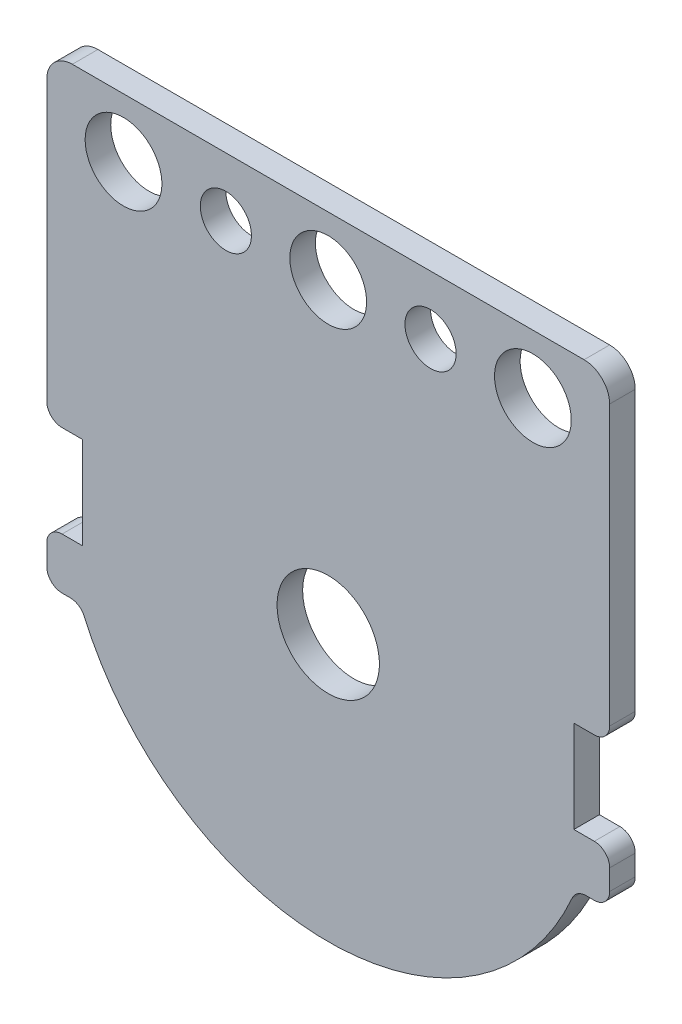
ISO-10303-21;
HEADER;
FILE_DESCRIPTION(('STEP AP214'),'2;1');
FILE_NAME('part.step','',(''),(''),'','','');
FILE_SCHEMA(('AUTOMOTIVE_DESIGN { 1 0 10303 214 1 1 1 1 }'));
ENDSEC;
DATA;
#1=APPLICATION_CONTEXT('core data for automotive mechanical design processes');
#2=APPLICATION_PROTOCOL_DEFINITION('international standard','automotive_design',2000,#1);
#3=PRODUCT_CONTEXT('',#1,'mechanical');
#4=PRODUCT('Part','Part','',(#3));
#5=PRODUCT_RELATED_PRODUCT_CATEGORY('part','',(#4));
#6=PRODUCT_DEFINITION_FORMATION('','',#4);
#7=PRODUCT_DEFINITION_CONTEXT('part definition',#1,'design');
#8=PRODUCT_DEFINITION('design','',#6,#7);
#9=PRODUCT_DEFINITION_SHAPE('','',#8);
#10=(LENGTH_UNIT() NAMED_UNIT(*) SI_UNIT(.MILLI.,.METRE.));
#11=(NAMED_UNIT(*) PLANE_ANGLE_UNIT() SI_UNIT($,.RADIAN.));
#12=(NAMED_UNIT(*) SI_UNIT($,.STERADIAN.) SOLID_ANGLE_UNIT());
#13=UNCERTAINTY_MEASURE_WITH_UNIT(LENGTH_MEASURE(1.E-05),#10,'distance_accuracy_value','');
#14=(GEOMETRIC_REPRESENTATION_CONTEXT(3) GLOBAL_UNCERTAINTY_ASSIGNED_CONTEXT((#13)) GLOBAL_UNIT_ASSIGNED_CONTEXT((#10,
#11,#12)) REPRESENTATION_CONTEXT('',''));
#15=CARTESIAN_POINT('',(0.,0.,0.));
#16=DIRECTION('',(0.,0.,1.));
#17=DIRECTION('',(1.,0.,0.));
#18=AXIS2_PLACEMENT_3D('',#15,#16,#17);
#19=CARTESIAN_POINT('',(5.04083326445142,-3.35,0.));
#20=DIRECTION('',(0.,0.,-1.));
#21=DIRECTION('',(-0.91651513899117,0.4,0.));
#22=AXIS2_PLACEMENT_3D('',#19,#20,#21);
#23=CYLINDRICAL_SURFACE('',#22,0.3);
#24=CARTESIAN_POINT('',(5.04083326445142,-3.35,0.));
#25=DIRECTION('',(0.,0.,-1.));
#26=DIRECTION('',(-0.91651513899117,0.4,0.));
#27=AXIS2_PLACEMENT_3D('',#24,#25,#26);
#28=CIRCLE('',#27,0.3);
#29=CARTESIAN_POINT('',(4.76587872275407,-3.23,0.));
#30=VERTEX_POINT('',#29);
#31=CARTESIAN_POINT('',(5.04083326445142,-3.05,0.));
#32=VERTEX_POINT('',#31);
#33=EDGE_CURVE('E383',#30,#32,#28,.T.);
#34=ORIENTED_EDGE('',*,*,#33,.T.);
#35=DIRECTION('',(0.,0.,1.));
#36=VECTOR('',#35,1.);
#37=CARTESIAN_POINT('',(5.04083326445142,-3.05,0.));
#38=LINE('',#37,#36);
#39=CARTESIAN_POINT('',(5.04083326445142,-3.05,0.5));
#40=VERTEX_POINT('',#39);
#41=EDGE_CURVE('E11',#32,#40,#38,.T.);
#42=ORIENTED_EDGE('',*,*,#41,.T.);
#43=CARTESIAN_POINT('',(5.04083326445142,-3.35,0.5));
#44=DIRECTION('',(0.,0.,-1.));
#45=DIRECTION('',(-0.91651513899117,0.4,0.));
#46=AXIS2_PLACEMENT_3D('',#43,#44,#45);
#47=CIRCLE('',#46,0.3);
#48=CARTESIAN_POINT('',(4.76587872275407,-3.23,0.5));
#49=VERTEX_POINT('',#48);
#50=EDGE_CURVE('E291',#49,#40,#47,.T.);
#51=ORIENTED_EDGE('',*,*,#50,.F.);
#52=DIRECTION('',(0.,0.,1.));
#53=VECTOR('',#52,1.);
#54=CARTESIAN_POINT('',(4.76587872275407,-3.23,0.));
#55=LINE('',#54,#53);
#56=EDGE_CURVE('E321',#30,#49,#55,.T.);
#57=ORIENTED_EDGE('',*,*,#56,.F.);
#58=EDGE_LOOP('',(#34,#42,#51,#57));
#59=FACE_BOUND('',#58,.T.);
#60=ADVANCED_FACE('F16',(#59),#23,.F.);
#61=CARTESIAN_POINT('',(5.04083326445142,-3.05,0.));
#62=DIRECTION('',(0.,-1.,0.));
#63=DIRECTION('',(0.,0.,-1.));
#64=AXIS2_PLACEMENT_3D('',#61,#62,#63);
#65=PLANE('',#64);
#66=DIRECTION('',(1.,0.,0.));
#67=VECTOR('',#66,1.);
#68=CARTESIAN_POINT('',(5.04083326445142,-3.05,0.));
#69=LINE('',#68,#67);
#70=CARTESIAN_POINT('',(5.2,-3.05,0.));
#71=VERTEX_POINT('',#70);
#72=EDGE_CURVE('E432',#32,#71,#69,.T.);
#73=ORIENTED_EDGE('',*,*,#72,.T.);
#74=DIRECTION('',(0.,0.,1.));
#75=VECTOR('',#74,1.);
#76=CARTESIAN_POINT('',(5.2,-3.05,0.));
#77=LINE('',#76,#75);
#78=CARTESIAN_POINT('',(5.2,-3.05,0.5));
#79=VERTEX_POINT('',#78);
#80=EDGE_CURVE('E27',#71,#79,#77,.T.);
#81=ORIENTED_EDGE('',*,*,#80,.T.);
#82=DIRECTION('',(1.,0.,0.));
#83=VECTOR('',#82,1.);
#84=CARTESIAN_POINT('',(5.04083326445142,-3.05,0.5));
#85=LINE('',#84,#83);
#86=EDGE_CURVE('E286',#40,#79,#85,.T.);
#87=ORIENTED_EDGE('',*,*,#86,.F.);
#88=ORIENTED_EDGE('',*,*,#41,.F.);
#89=EDGE_LOOP('',(#73,#81,#87,#88));
#90=FACE_BOUND('',#89,.T.);
#91=ADVANCED_FACE('F596',(#90),#65,.T.);
#92=CARTESIAN_POINT('',(5.2,-2.75,0.));
#93=DIRECTION('',(0.,0.,1.));
#94=DIRECTION('',(0.,-1.,0.));
#95=AXIS2_PLACEMENT_3D('',#92,#93,#94);
#96=CYLINDRICAL_SURFACE('',#95,0.3);
#97=CARTESIAN_POINT('',(5.2,-2.75,0.));
#98=DIRECTION('',(0.,0.,1.));
#99=DIRECTION('',(0.,-1.,0.));
#100=AXIS2_PLACEMENT_3D('',#97,#98,#99);
#101=CIRCLE('',#100,0.3);
#102=CARTESIAN_POINT('',(5.5,-2.75,0.));
#103=VERTEX_POINT('',#102);
#104=EDGE_CURVE('E443',#71,#103,#101,.T.);
#105=ORIENTED_EDGE('',*,*,#104,.T.);
#106=DIRECTION('',(0.,0.,1.));
#107=VECTOR('',#106,1.);
#108=CARTESIAN_POINT('',(5.5,-2.75,0.));
#109=LINE('',#108,#107);
#110=CARTESIAN_POINT('',(5.5,-2.75,0.5));
#111=VERTEX_POINT('',#110);
#112=EDGE_CURVE('E359',#103,#111,#109,.T.);
#113=ORIENTED_EDGE('',*,*,#112,.T.);
#114=CARTESIAN_POINT('',(5.2,-2.75,0.5));
#115=DIRECTION('',(0.,0.,1.));
#116=DIRECTION('',(0.,-1.,0.));
#117=AXIS2_PLACEMENT_3D('',#114,#115,#116);
#118=CIRCLE('',#117,0.3);
#119=EDGE_CURVE('E290',#79,#111,#118,.T.);
#120=ORIENTED_EDGE('',*,*,#119,.F.);
#121=ORIENTED_EDGE('',*,*,#80,.F.);
#122=EDGE_LOOP('',(#105,#113,#120,#121));
#123=FACE_BOUND('',#122,.T.);
#124=ADVANCED_FACE('F609',(#123),#96,.T.);
#125=CARTESIAN_POINT('',(5.5,-2.75,0.));
#126=DIRECTION('',(1.,0.,0.));
#127=DIRECTION('',(0.,1.,0.));
#128=AXIS2_PLACEMENT_3D('',#125,#126,#127);
#129=PLANE('',#128);
#130=DIRECTION('',(0.,1.,0.));
#131=VECTOR('',#130,1.);
#132=CARTESIAN_POINT('',(5.5,-2.75,0.));
#133=LINE('',#132,#131);
#134=CARTESIAN_POINT('',(5.5,-2.35,0.));
#135=VERTEX_POINT('',#134);
#136=EDGE_CURVE('E330',#103,#135,#133,.T.);
#137=ORIENTED_EDGE('',*,*,#136,.T.);
#138=DIRECTION('',(0.,0.,1.));
#139=VECTOR('',#138,1.);
#140=CARTESIAN_POINT('',(5.5,-2.35,0.));
#141=LINE('',#140,#139);
#142=CARTESIAN_POINT('',(5.5,-2.35,0.5));
#143=VERTEX_POINT('',#142);
#144=EDGE_CURVE('E325',#135,#143,#141,.T.);
#145=ORIENTED_EDGE('',*,*,#144,.T.);
#146=DIRECTION('',(0.,1.,0.));
#147=VECTOR('',#146,1.);
#148=CARTESIAN_POINT('',(5.5,-2.75,0.5));
#149=LINE('',#148,#147);
#150=EDGE_CURVE('E292',#111,#143,#149,.T.);
#151=ORIENTED_EDGE('',*,*,#150,.F.);
#152=ORIENTED_EDGE('',*,*,#112,.F.);
#153=EDGE_LOOP('',(#137,#145,#151,#152));
#154=FACE_BOUND('',#153,.T.);
#155=ADVANCED_FACE('F625',(#154),#129,.T.);
#156=CARTESIAN_POINT('',(5.2,-2.35,0.));
#157=DIRECTION('',(0.,0.,1.));
#158=DIRECTION('',(1.,0.,0.));
#159=AXIS2_PLACEMENT_3D('',#156,#157,#158);
#160=CYLINDRICAL_SURFACE('',#159,0.3);
#161=CARTESIAN_POINT('',(5.2,-2.35,0.));
#162=DIRECTION('',(0.,0.,1.));
#163=DIRECTION('',(1.,0.,0.));
#164=AXIS2_PLACEMENT_3D('',#161,#162,#163);
#165=CIRCLE('',#164,0.3);
#166=CARTESIAN_POINT('',(5.2,-2.05,0.));
#167=VERTEX_POINT('',#166);
#168=EDGE_CURVE('E326',#135,#167,#165,.T.);
#169=ORIENTED_EDGE('',*,*,#168,.T.);
#170=DIRECTION('',(0.,0.,1.));
#171=VECTOR('',#170,1.);
#172=CARTESIAN_POINT('',(5.2,-2.05,0.));
#173=LINE('',#172,#171);
#174=CARTESIAN_POINT('',(5.2,-2.05,0.5));
#175=VERTEX_POINT('',#174);
#176=EDGE_CURVE('E299',#167,#175,#173,.T.);
#177=ORIENTED_EDGE('',*,*,#176,.T.);
#178=CARTESIAN_POINT('',(5.2,-2.35,0.5));
#179=DIRECTION('',(0.,0.,1.));
#180=DIRECTION('',(1.,0.,0.));
#181=AXIS2_PLACEMENT_3D('',#178,#179,#180);
#182=CIRCLE('',#181,0.3);
#183=EDGE_CURVE('E240',#143,#175,#182,.T.);
#184=ORIENTED_EDGE('',*,*,#183,.F.);
#185=ORIENTED_EDGE('',*,*,#144,.F.);
#186=EDGE_LOOP('',(#169,#177,#184,#185));
#187=FACE_BOUND('',#186,.T.);
#188=ADVANCED_FACE('F621',(#187),#160,.T.);
#189=CARTESIAN_POINT('',(5.2,-2.05,0.));
#190=DIRECTION('',(0.,1.,0.));
#191=DIRECTION('',(1.,0.,0.));
#192=AXIS2_PLACEMENT_3D('',#189,#190,#191);
#193=PLANE('',#192);
#194=DIRECTION('',(-1.,0.,0.));
#195=VECTOR('',#194,1.);
#196=CARTESIAN_POINT('',(5.2,-2.05,0.));
#197=LINE('',#196,#195);
#198=CARTESIAN_POINT('',(4.8,-2.05,0.));
#199=VERTEX_POINT('',#198);
#200=EDGE_CURVE('E331',#167,#199,#197,.T.);
#201=ORIENTED_EDGE('',*,*,#200,.T.);
#202=DIRECTION('',(0.,0.,1.));
#203=VECTOR('',#202,1.);
#204=CARTESIAN_POINT('',(4.8,-2.05,0.));
#205=LINE('',#204,#203);
#206=CARTESIAN_POINT('',(4.8,-2.05,0.5));
#207=VERTEX_POINT('',#206);
#208=EDGE_CURVE('E296',#199,#207,#205,.T.);
#209=ORIENTED_EDGE('',*,*,#208,.T.);
#210=DIRECTION('',(-1.,0.,0.));
#211=VECTOR('',#210,1.);
#212=CARTESIAN_POINT('',(5.2,-2.05,0.5));
#213=LINE('',#212,#211);
#214=EDGE_CURVE('E353',#175,#207,#213,.T.);
#215=ORIENTED_EDGE('',*,*,#214,.F.);
#216=ORIENTED_EDGE('',*,*,#176,.F.);
#217=EDGE_LOOP('',(#201,#209,#215,#216));
#218=FACE_BOUND('',#217,.T.);
#219=ADVANCED_FACE('F551',(#218),#193,.T.);
#220=CARTESIAN_POINT('',(4.8,-2.05,0.));
#221=DIRECTION('',(1.,0.,0.));
#222=DIRECTION('',(0.,1.,0.));
#223=AXIS2_PLACEMENT_3D('',#220,#221,#222);
#224=PLANE('',#223);
#225=DIRECTION('',(0.,1.,0.));
#226=VECTOR('',#225,1.);
#227=CARTESIAN_POINT('',(4.8,-2.05,0.));
#228=LINE('',#227,#226);
#229=CARTESIAN_POINT('',(4.8,-0.250000000000008,0.));
#230=VERTEX_POINT('',#229);
#231=EDGE_CURVE('E315',#199,#230,#228,.T.);
#232=ORIENTED_EDGE('',*,*,#231,.T.);
#233=DIRECTION('',(0.,0.,1.));
#234=VECTOR('',#233,1.);
#235=CARTESIAN_POINT('',(4.8,-0.250000000000008,0.));
#236=LINE('',#235,#234);
#237=CARTESIAN_POINT('',(4.8,-0.250000000000008,0.5));
#238=VERTEX_POINT('',#237);
#239=EDGE_CURVE('E300',#230,#238,#236,.T.);
#240=ORIENTED_EDGE('',*,*,#239,.T.);
#241=DIRECTION('',(0.,1.,0.));
#242=VECTOR('',#241,1.);
#243=CARTESIAN_POINT('',(4.8,-2.05,0.5));
#244=LINE('',#243,#242);
#245=EDGE_CURVE('E348',#207,#238,#244,.T.);
#246=ORIENTED_EDGE('',*,*,#245,.F.);
#247=ORIENTED_EDGE('',*,*,#208,.F.);
#248=EDGE_LOOP('',(#232,#240,#246,#247));
#249=FACE_BOUND('',#248,.T.);
#250=ADVANCED_FACE('F540',(#249),#224,.T.);
#251=CARTESIAN_POINT('',(4.8,-0.250000000000008,0.));
#252=DIRECTION('',(0.,-1.,0.));
#253=DIRECTION('',(0.,0.,-1.));
#254=AXIS2_PLACEMENT_3D('',#251,#252,#253);
#255=PLANE('',#254);
#256=DIRECTION('',(1.,0.,0.));
#257=VECTOR('',#256,1.);
#258=CARTESIAN_POINT('',(4.8,-0.250000000000008,0.));
#259=LINE('',#258,#257);
#260=CARTESIAN_POINT('',(5.2,-0.250000000000006,0.));
#261=VERTEX_POINT('',#260);
#262=EDGE_CURVE('E311',#230,#261,#259,.T.);
#263=ORIENTED_EDGE('',*,*,#262,.T.);
#264=DIRECTION('',(0.,0.,1.));
#265=VECTOR('',#264,1.);
#266=CARTESIAN_POINT('',(5.2,-0.250000000000008,0.));
#267=LINE('',#266,#265);
#268=CARTESIAN_POINT('',(5.2,-0.250000000000006,0.5));
#269=VERTEX_POINT('',#268);
#270=EDGE_CURVE('E396',#261,#269,#267,.T.);
#271=ORIENTED_EDGE('',*,*,#270,.T.);
#272=DIRECTION('',(1.,0.,0.));
#273=VECTOR('',#272,1.);
#274=CARTESIAN_POINT('',(4.8,-0.250000000000008,0.5));
#275=LINE('',#274,#273);
#276=EDGE_CURVE('E352',#238,#269,#275,.T.);
#277=ORIENTED_EDGE('',*,*,#276,.F.);
#278=ORIENTED_EDGE('',*,*,#239,.F.);
#279=EDGE_LOOP('',(#263,#271,#277,#278));
#280=FACE_BOUND('',#279,.T.);
#281=ADVANCED_FACE('F544',(#280),#255,.T.);
#282=CARTESIAN_POINT('',(5.2,0.0499999999999939,0.));
#283=DIRECTION('',(0.,0.,1.));
#284=DIRECTION('',(0.,-1.,0.));
#285=AXIS2_PLACEMENT_3D('',#282,#283,#284);
#286=CYLINDRICAL_SURFACE('',#285,0.3);
#287=CARTESIAN_POINT('',(5.2,0.0499999999999939,0.));
#288=DIRECTION('',(0.,0.,1.));
#289=DIRECTION('',(0.,-1.,0.));
#290=AXIS2_PLACEMENT_3D('',#287,#288,#289);
#291=CIRCLE('',#290,0.3);
#292=CARTESIAN_POINT('',(5.5,0.0499999999999917,0.));
#293=VERTEX_POINT('',#292);
#294=EDGE_CURVE('E316',#261,#293,#291,.T.);
#295=ORIENTED_EDGE('',*,*,#294,.T.);
#296=DIRECTION('',(0.,0.,1.));
#297=VECTOR('',#296,1.);
#298=CARTESIAN_POINT('',(5.5,0.0499999999999917,0.));
#299=LINE('',#298,#297);
#300=CARTESIAN_POINT('',(5.5,0.0499999999999917,0.5));
#301=VERTEX_POINT('',#300);
#302=EDGE_CURVE('E370',#293,#301,#299,.T.);
#303=ORIENTED_EDGE('',*,*,#302,.T.);
#304=CARTESIAN_POINT('',(5.2,0.0499999999999939,0.5));
#305=DIRECTION('',(0.,0.,1.));
#306=DIRECTION('',(0.,-1.,0.));
#307=AXIS2_PLACEMENT_3D('',#304,#305,#306);
#308=CIRCLE('',#307,0.3);
#309=EDGE_CURVE('E264',#269,#301,#308,.T.);
#310=ORIENTED_EDGE('',*,*,#309,.F.);
#311=ORIENTED_EDGE('',*,*,#270,.F.);
#312=EDGE_LOOP('',(#295,#303,#310,#311));
#313=FACE_BOUND('',#312,.T.);
#314=ADVANCED_FACE('F629',(#313),#286,.T.);
#315=CARTESIAN_POINT('',(5.5,0.0499999999999917,0.));
#316=DIRECTION('',(1.,0.,0.));
#317=DIRECTION('',(0.,-1.,0.));
#318=AXIS2_PLACEMENT_3D('',#315,#316,#317);
#319=PLANE('',#318);
#320=DIRECTION('',(0.,1.,0.));
#321=VECTOR('',#320,1.);
#322=CARTESIAN_POINT('',(5.5,0.0499999999999917,0.));
#323=LINE('',#322,#321);
#324=CARTESIAN_POINT('',(5.5,5.5,0.));
#325=VERTEX_POINT('',#324);
#326=EDGE_CURVE('E371',#293,#325,#323,.T.);
#327=ORIENTED_EDGE('',*,*,#326,.T.);
#328=DIRECTION('',(0.,0.,1.));
#329=VECTOR('',#328,1.);
#330=CARTESIAN_POINT('',(5.5,5.5,0.));
#331=LINE('',#330,#329);
#332=CARTESIAN_POINT('',(5.5,5.5,0.5));
#333=VERTEX_POINT('',#332);
#334=EDGE_CURVE('E367',#325,#333,#331,.T.);
#335=ORIENTED_EDGE('',*,*,#334,.T.);
#336=DIRECTION('',(0.,1.,0.));
#337=VECTOR('',#336,1.);
#338=CARTESIAN_POINT('',(5.5,0.0499999999999917,0.5));
#339=LINE('',#338,#337);
#340=EDGE_CURVE('E260',#301,#333,#339,.T.);
#341=ORIENTED_EDGE('',*,*,#340,.F.);
#342=ORIENTED_EDGE('',*,*,#302,.F.);
#343=EDGE_LOOP('',(#327,#335,#341,#342));
#344=FACE_BOUND('',#343,.T.);
#345=ADVANCED_FACE('F632',(#344),#319,.T.);
#346=CARTESIAN_POINT('',(5.,5.5,0.));
#347=DIRECTION('',(0.,0.,1.));
#348=DIRECTION('',(1.,0.,0.));
#349=AXIS2_PLACEMENT_3D('',#346,#347,#348);
#350=CYLINDRICAL_SURFACE('',#349,0.5);
#351=CARTESIAN_POINT('',(5.,5.5,0.));
#352=DIRECTION('',(0.,0.,1.));
#353=DIRECTION('',(1.,0.,0.));
#354=AXIS2_PLACEMENT_3D('',#351,#352,#353);
#355=CIRCLE('',#354,0.5);
#356=CARTESIAN_POINT('',(5.,6.,0.));
#357=VERTEX_POINT('',#356);
#358=EDGE_CURVE('E375',#325,#357,#355,.T.);
#359=ORIENTED_EDGE('',*,*,#358,.T.);
#360=DIRECTION('',(0.,0.,1.));
#361=VECTOR('',#360,1.);
#362=CARTESIAN_POINT('',(5.,6.,0.));
#363=LINE('',#362,#361);
#364=CARTESIAN_POINT('',(5.,6.,0.5));
#365=VERTEX_POINT('',#364);
#366=EDGE_CURVE('E310',#357,#365,#363,.T.);
#367=ORIENTED_EDGE('',*,*,#366,.T.);
#368=CARTESIAN_POINT('',(5.,5.5,0.5));
#369=DIRECTION('',(0.,0.,1.));
#370=DIRECTION('',(1.,0.,0.));
#371=AXIS2_PLACEMENT_3D('',#368,#369,#370);
#372=CIRCLE('',#371,0.5);
#373=EDGE_CURVE('E247',#333,#365,#372,.T.);
#374=ORIENTED_EDGE('',*,*,#373,.F.);
#375=ORIENTED_EDGE('',*,*,#334,.F.);
#376=EDGE_LOOP('',(#359,#367,#374,#375));
#377=FACE_BOUND('',#376,.T.);
#378=ADVANCED_FACE('F633',(#377),#350,.T.);
#379=CARTESIAN_POINT('',(5.,6.,0.));
#380=DIRECTION('',(0.,1.,0.));
#381=DIRECTION('',(1.,0.,0.));
#382=AXIS2_PLACEMENT_3D('',#379,#380,#381);
#383=PLANE('',#382);
#384=DIRECTION('',(-1.,0.,0.));
#385=VECTOR('',#384,1.);
#386=CARTESIAN_POINT('',(5.,6.,0.));
#387=LINE('',#386,#385);
#388=CARTESIAN_POINT('',(-5.,6.,0.));
#389=VERTEX_POINT('',#388);
#390=EDGE_CURVE('E252',#357,#389,#387,.T.);
#391=ORIENTED_EDGE('',*,*,#390,.T.);
#392=DIRECTION('',(0.,0.,1.));
#393=VECTOR('',#392,1.);
#394=CARTESIAN_POINT('',(-5.,6.,0.));
#395=LINE('',#394,#393);
#396=CARTESIAN_POINT('',(-5.,6.,0.5));
#397=VERTEX_POINT('',#396);
#398=EDGE_CURVE('E284',#389,#397,#395,.T.);
#399=ORIENTED_EDGE('',*,*,#398,.T.);
#400=DIRECTION('',(-1.,0.,0.));
#401=VECTOR('',#400,1.);
#402=CARTESIAN_POINT('',(5.,6.,0.5));
#403=LINE('',#402,#401);
#404=EDGE_CURVE('E242',#365,#397,#403,.T.);
#405=ORIENTED_EDGE('',*,*,#404,.F.);
#406=ORIENTED_EDGE('',*,*,#366,.F.);
#407=EDGE_LOOP('',(#391,#399,#405,#406));
#408=FACE_BOUND('',#407,.T.);
#409=ADVANCED_FACE('F506',(#408),#383,.T.);
#410=CARTESIAN_POINT('',(-5.,5.5,0.));
#411=DIRECTION('',(0.,0.,1.));
#412=DIRECTION('',(0.,1.,0.));
#413=AXIS2_PLACEMENT_3D('',#410,#411,#412);
#414=CYLINDRICAL_SURFACE('',#413,0.5);
#415=CARTESIAN_POINT('',(-5.,5.5,0.));
#416=DIRECTION('',(0.,0.,1.));
#417=DIRECTION('',(0.,1.,0.));
#418=AXIS2_PLACEMENT_3D('',#415,#416,#417);
#419=CIRCLE('',#418,0.5);
#420=CARTESIAN_POINT('',(-5.5,5.5,0.));
#421=VERTEX_POINT('',#420);
#422=EDGE_CURVE('E248',#389,#421,#419,.T.);
#423=ORIENTED_EDGE('',*,*,#422,.T.);
#424=DIRECTION('',(0.,0.,1.));
#425=VECTOR('',#424,1.);
#426=CARTESIAN_POINT('',(-5.5,5.5,0.));
#427=LINE('',#426,#425);
#428=CARTESIAN_POINT('',(-5.5,5.5,0.5));
#429=VERTEX_POINT('',#428);
#430=EDGE_CURVE('E280',#421,#429,#427,.T.);
#431=ORIENTED_EDGE('',*,*,#430,.T.);
#432=CARTESIAN_POINT('',(-5.,5.5,0.5));
#433=DIRECTION('',(0.,0.,1.));
#434=DIRECTION('',(0.,1.,0.));
#435=AXIS2_PLACEMENT_3D('',#432,#433,#434);
#436=CIRCLE('',#435,0.5);
#437=EDGE_CURVE('E246',#397,#429,#436,.T.);
#438=ORIENTED_EDGE('',*,*,#437,.F.);
#439=ORIENTED_EDGE('',*,*,#398,.F.);
#440=EDGE_LOOP('',(#423,#431,#438,#439));
#441=FACE_BOUND('',#440,.T.);
#442=ADVANCED_FACE('F518',(#441),#414,.T.);
#443=CARTESIAN_POINT('',(-5.5,5.5,0.));
#444=DIRECTION('',(-1.,0.,0.));
#445=DIRECTION('',(0.,0.,1.));
#446=AXIS2_PLACEMENT_3D('',#443,#444,#445);
#447=PLANE('',#446);
#448=DIRECTION('',(0.,-1.,0.));
#449=VECTOR('',#448,1.);
#450=CARTESIAN_POINT('',(-5.5,5.5,0.));
#451=LINE('',#450,#449);
#452=CARTESIAN_POINT('',(-5.5,0.0499999999999958,0.));
#453=VERTEX_POINT('',#452);
#454=EDGE_CURVE('E253',#421,#453,#451,.T.);
#455=ORIENTED_EDGE('',*,*,#454,.T.);
#456=DIRECTION('',(0.,0.,1.));
#457=VECTOR('',#456,1.);
#458=CARTESIAN_POINT('',(-5.5,0.0499999999999954,0.));
#459=LINE('',#458,#457);
#460=CARTESIAN_POINT('',(-5.5,0.0499999999999958,0.5));
#461=VERTEX_POINT('',#460);
#462=EDGE_CURVE('E285',#453,#461,#459,.T.);
#463=ORIENTED_EDGE('',*,*,#462,.T.);
#464=DIRECTION('',(0.,-1.,0.));
#465=VECTOR('',#464,1.);
#466=CARTESIAN_POINT('',(-5.5,5.5,0.5));
#467=LINE('',#466,#465);
#468=EDGE_CURVE('E389',#429,#461,#467,.T.);
#469=ORIENTED_EDGE('',*,*,#468,.F.);
#470=ORIENTED_EDGE('',*,*,#430,.F.);
#471=EDGE_LOOP('',(#455,#463,#469,#470));
#472=FACE_BOUND('',#471,.T.);
#473=ADVANCED_FACE('F18',(#472),#447,.T.);
#474=CARTESIAN_POINT('',(-5.2,0.0499999999999958,0.));
#475=DIRECTION('',(0.,0.,1.));
#476=DIRECTION('',(-1.,0.,0.));
#477=AXIS2_PLACEMENT_3D('',#474,#475,#476);
#478=CYLINDRICAL_SURFACE('',#477,0.3);
#479=CARTESIAN_POINT('',(-5.2,0.0499999999999958,0.));
#480=DIRECTION('',(0.,0.,1.));
#481=DIRECTION('',(-1.,0.,0.));
#482=AXIS2_PLACEMENT_3D('',#479,#480,#481);
#483=CIRCLE('',#482,0.3);
#484=CARTESIAN_POINT('',(-5.2,-0.250000000000006,0.));
#485=VERTEX_POINT('',#484);
#486=EDGE_CURVE('E265',#453,#485,#483,.T.);
#487=ORIENTED_EDGE('',*,*,#486,.T.);
#488=DIRECTION('',(0.,0.,1.));
#489=VECTOR('',#488,1.);
#490=CARTESIAN_POINT('',(-5.2,-0.250000000000006,0.));
#491=LINE('',#490,#489);
#492=CARTESIAN_POINT('',(-5.2,-0.250000000000006,0.5));
#493=VERTEX_POINT('',#492);
#494=EDGE_CURVE('E143',#485,#493,#491,.T.);
#495=ORIENTED_EDGE('',*,*,#494,.T.);
#496=CARTESIAN_POINT('',(-5.2,0.0499999999999958,0.5));
#497=DIRECTION('',(0.,0.,1.));
#498=DIRECTION('',(-1.,0.,0.));
#499=AXIS2_PLACEMENT_3D('',#496,#497,#498);
#500=CIRCLE('',#499,0.3);
#501=EDGE_CURVE('E306',#461,#493,#500,.T.);
#502=ORIENTED_EDGE('',*,*,#501,.F.);
#503=ORIENTED_EDGE('',*,*,#462,.F.);
#504=EDGE_LOOP('',(#487,#495,#502,#503));
#505=FACE_BOUND('',#504,.T.);
#506=ADVANCED_FACE('F695',(#505),#478,.T.);
#507=CARTESIAN_POINT('',(-5.2,-0.250000000000006,0.));
#508=DIRECTION('',(0.,-1.,0.));
#509=DIRECTION('',(0.,0.,-1.));
#510=AXIS2_PLACEMENT_3D('',#507,#508,#509);
#511=PLANE('',#510);
#512=DIRECTION('',(1.,0.,0.));
#513=VECTOR('',#512,1.);
#514=CARTESIAN_POINT('',(-5.2,-0.250000000000006,0.));
#515=LINE('',#514,#513);
#516=CARTESIAN_POINT('',(-4.8,-0.250000000000006,0.));
#517=VERTEX_POINT('',#516);
#518=EDGE_CURVE('E258',#485,#517,#515,.T.);
#519=ORIENTED_EDGE('',*,*,#518,.T.);
#520=DIRECTION('',(0.,0.,1.));
#521=VECTOR('',#520,1.);
#522=CARTESIAN_POINT('',(-4.8,-0.250000000000006,0.));
#523=LINE('',#522,#521);
#524=CARTESIAN_POINT('',(-4.8,-0.250000000000006,0.5));
#525=VERTEX_POINT('',#524);
#526=EDGE_CURVE('E130',#517,#525,#523,.T.);
#527=ORIENTED_EDGE('',*,*,#526,.T.);
#528=DIRECTION('',(1.,0.,0.));
#529=VECTOR('',#528,1.);
#530=CARTESIAN_POINT('',(-5.2,-0.250000000000006,0.5));
#531=LINE('',#530,#529);
#532=EDGE_CURVE('E301',#493,#525,#531,.T.);
#533=ORIENTED_EDGE('',*,*,#532,.F.);
#534=ORIENTED_EDGE('',*,*,#494,.F.);
#535=EDGE_LOOP('',(#519,#527,#533,#534));
#536=FACE_BOUND('',#535,.T.);
#537=ADVANCED_FACE('F686',(#536),#511,.T.);
#538=CARTESIAN_POINT('',(-4.8,-0.250000000000006,0.));
#539=DIRECTION('',(-1.,0.,0.));
#540=DIRECTION('',(0.,0.,1.));
#541=AXIS2_PLACEMENT_3D('',#538,#539,#540);
#542=PLANE('',#541);
#543=DIRECTION('',(0.,-1.,0.));
#544=VECTOR('',#543,1.);
#545=CARTESIAN_POINT('',(-4.8,-0.250000000000006,0.));
#546=LINE('',#545,#544);
#547=CARTESIAN_POINT('',(-4.8,-2.05,0.));
#548=VERTEX_POINT('',#547);
#549=EDGE_CURVE('E254',#517,#548,#546,.T.);
#550=ORIENTED_EDGE('',*,*,#549,.T.);
#551=DIRECTION('',(0.,0.,1.));
#552=VECTOR('',#551,1.);
#553=CARTESIAN_POINT('',(-4.8,-2.05,0.));
#554=LINE('',#553,#552);
#555=CARTESIAN_POINT('',(-4.8,-2.05,0.5));
#556=VERTEX_POINT('',#555);
#557=EDGE_CURVE('E279',#548,#556,#554,.T.);
#558=ORIENTED_EDGE('',*,*,#557,.T.);
#559=DIRECTION('',(0.,-1.,0.));
#560=VECTOR('',#559,1.);
#561=CARTESIAN_POINT('',(-4.8,-0.250000000000006,0.5));
#562=LINE('',#561,#560);
#563=EDGE_CURVE('E305',#525,#556,#562,.T.);
#564=ORIENTED_EDGE('',*,*,#563,.F.);
#565=ORIENTED_EDGE('',*,*,#526,.F.);
#566=EDGE_LOOP('',(#550,#558,#564,#565));
#567=FACE_BOUND('',#566,.T.);
#568=ADVANCED_FACE('F683',(#567),#542,.T.);
#569=CARTESIAN_POINT('',(-4.8,-2.05,0.));
#570=DIRECTION('',(0.,1.,0.));
#571=DIRECTION('',(1.,0.,0.));
#572=AXIS2_PLACEMENT_3D('',#569,#570,#571);
#573=PLANE('',#572);
#574=DIRECTION('',(-1.,0.,0.));
#575=VECTOR('',#574,1.);
#576=CARTESIAN_POINT('',(-4.8,-2.05,0.));
#577=LINE('',#576,#575);
#578=CARTESIAN_POINT('',(-5.2,-2.05,0.));
#579=VERTEX_POINT('',#578);
#580=EDGE_CURVE('E259',#548,#579,#577,.T.);
#581=ORIENTED_EDGE('',*,*,#580,.T.);
#582=DIRECTION('',(0.,0.,1.));
#583=VECTOR('',#582,1.);
#584=CARTESIAN_POINT('',(-5.2,-2.05,0.));
#585=LINE('',#584,#583);
#586=CARTESIAN_POINT('',(-5.2,-2.05,0.5));
#587=VERTEX_POINT('',#586);
#588=EDGE_CURVE('E276',#579,#587,#585,.T.);
#589=ORIENTED_EDGE('',*,*,#588,.T.);
#590=DIRECTION('',(-1.,0.,0.));
#591=VECTOR('',#590,1.);
#592=CARTESIAN_POINT('',(-4.8,-2.05,0.5));
#593=LINE('',#592,#591);
#594=EDGE_CURVE('E354',#556,#587,#593,.T.);
#595=ORIENTED_EDGE('',*,*,#594,.F.);
#596=ORIENTED_EDGE('',*,*,#557,.F.);
#597=EDGE_LOOP('',(#581,#589,#595,#596));
#598=FACE_BOUND('',#597,.T.);
#599=ADVANCED_FACE('F666',(#598),#573,.T.);
#600=CARTESIAN_POINT('',(-5.2,-2.35,0.));
#601=DIRECTION('',(0.,0.,1.));
#602=DIRECTION('',(0.,1.,0.));
#603=AXIS2_PLACEMENT_3D('',#600,#601,#602);
#604=CYLINDRICAL_SURFACE('',#603,0.3);
#605=CARTESIAN_POINT('',(-5.2,-2.35,0.));
#606=DIRECTION('',(0.,0.,1.));
#607=DIRECTION('',(0.,1.,0.));
#608=AXIS2_PLACEMENT_3D('',#605,#606,#607);
#609=CIRCLE('',#608,0.3);
#610=CARTESIAN_POINT('',(-5.5,-2.35,0.));
#611=VERTEX_POINT('',#610);
#612=EDGE_CURVE('E340',#579,#611,#609,.T.);
#613=ORIENTED_EDGE('',*,*,#612,.T.);
#614=DIRECTION('',(0.,0.,1.));
#615=VECTOR('',#614,1.);
#616=CARTESIAN_POINT('',(-5.5,-2.35,0.));
#617=LINE('',#616,#615);
#618=CARTESIAN_POINT('',(-5.5,-2.35,0.5));
#619=VERTEX_POINT('',#618);
#620=EDGE_CURVE('E274',#611,#619,#617,.T.);
#621=ORIENTED_EDGE('',*,*,#620,.T.);
#622=CARTESIAN_POINT('',(-5.2,-2.35,0.5));
#623=DIRECTION('',(0.,0.,1.));
#624=DIRECTION('',(0.,1.,0.));
#625=AXIS2_PLACEMENT_3D('',#622,#623,#624);
#626=CIRCLE('',#625,0.3);
#627=EDGE_CURVE('E358',#587,#619,#626,.T.);
#628=ORIENTED_EDGE('',*,*,#627,.F.);
#629=ORIENTED_EDGE('',*,*,#588,.F.);
#630=EDGE_LOOP('',(#613,#621,#628,#629));
#631=FACE_BOUND('',#630,.T.);
#632=ADVANCED_FACE('F662',(#631),#604,.T.);
#633=CARTESIAN_POINT('',(-5.5,-2.35,0.));
#634=DIRECTION('',(-1.,0.,0.));
#635=DIRECTION('',(0.,0.,1.));
#636=AXIS2_PLACEMENT_3D('',#633,#634,#635);
#637=PLANE('',#636);
#638=DIRECTION('',(0.,-1.,0.));
#639=VECTOR('',#638,1.);
#640=CARTESIAN_POINT('',(-5.5,-2.35,0.));
#641=LINE('',#640,#639);
#642=CARTESIAN_POINT('',(-5.5,-2.75,0.));
#643=VERTEX_POINT('',#642);
#644=EDGE_CURVE('E433',#611,#643,#641,.T.);
#645=ORIENTED_EDGE('',*,*,#644,.T.);
#646=DIRECTION('',(0.,0.,1.));
#647=VECTOR('',#646,1.);
#648=CARTESIAN_POINT('',(-5.5,-2.75,0.));
#649=LINE('',#648,#647);
#650=CARTESIAN_POINT('',(-5.5,-2.75,0.5));
#651=VERTEX_POINT('',#650);
#652=EDGE_CURVE('E271',#643,#651,#649,.T.);
#653=ORIENTED_EDGE('',*,*,#652,.T.);
#654=DIRECTION('',(0.,-1.,0.));
#655=VECTOR('',#654,1.);
#656=CARTESIAN_POINT('',(-5.5,-2.35,0.5));
#657=LINE('',#656,#655);
#658=EDGE_CURVE('E455',#619,#651,#657,.T.);
#659=ORIENTED_EDGE('',*,*,#658,.F.);
#660=ORIENTED_EDGE('',*,*,#620,.F.);
#661=EDGE_LOOP('',(#645,#653,#659,#660));
#662=FACE_BOUND('',#661,.T.);
#663=ADVANCED_FACE('F665',(#662),#637,.T.);
#664=CARTESIAN_POINT('',(-5.2,-2.75,0.));
#665=DIRECTION('',(0.,0.,1.));
#666=DIRECTION('',(-1.,0.,0.));
#667=AXIS2_PLACEMENT_3D('',#664,#665,#666);
#668=CYLINDRICAL_SURFACE('',#667,0.3);
#669=CARTESIAN_POINT('',(-5.2,-2.75,0.));
#670=DIRECTION('',(0.,0.,1.));
#671=DIRECTION('',(-1.,0.,0.));
#672=AXIS2_PLACEMENT_3D('',#669,#670,#671);
#673=CIRCLE('',#672,0.3);
#674=CARTESIAN_POINT('',(-5.2,-3.05,0.));
#675=VERTEX_POINT('',#674);
#676=EDGE_CURVE('E437',#643,#675,#673,.T.);
#677=ORIENTED_EDGE('',*,*,#676,.T.);
#678=DIRECTION('',(0.,0.,1.));
#679=VECTOR('',#678,1.);
#680=CARTESIAN_POINT('',(-5.2,-3.05,0.));
#681=LINE('',#680,#679);
#682=CARTESIAN_POINT('',(-5.2,-3.05,0.5));
#683=VERTEX_POINT('',#682);
#684=EDGE_CURVE('E275',#675,#683,#681,.T.);
#685=ORIENTED_EDGE('',*,*,#684,.T.);
#686=CARTESIAN_POINT('',(-5.2,-2.75,0.5));
#687=DIRECTION('',(0.,0.,1.));
#688=DIRECTION('',(-1.,0.,0.));
#689=AXIS2_PLACEMENT_3D('',#686,#687,#688);
#690=CIRCLE('',#689,0.3);
#691=EDGE_CURVE('E425',#651,#683,#690,.T.);
#692=ORIENTED_EDGE('',*,*,#691,.F.);
#693=ORIENTED_EDGE('',*,*,#652,.F.);
#694=EDGE_LOOP('',(#677,#685,#692,#693));
#695=FACE_BOUND('',#694,.T.);
#696=ADVANCED_FACE('F688',(#695),#668,.T.);
#697=CARTESIAN_POINT('',(-5.2,-3.05,0.));
#698=DIRECTION('',(0.,-1.,0.));
#699=DIRECTION('',(0.,0.,-1.));
#700=AXIS2_PLACEMENT_3D('',#697,#698,#699);
#701=PLANE('',#700);
#702=DIRECTION('',(1.,0.,0.));
#703=VECTOR('',#702,1.);
#704=CARTESIAN_POINT('',(-5.2,-3.05,0.));
#705=LINE('',#704,#703);
#706=CARTESIAN_POINT('',(-5.04083326445142,-3.05,0.));
#707=VERTEX_POINT('',#706);
#708=EDGE_CURVE('E403',#675,#707,#705,.T.);
#709=ORIENTED_EDGE('',*,*,#708,.T.);
#710=DIRECTION('',(0.,0.,1.));
#711=VECTOR('',#710,1.);
#712=CARTESIAN_POINT('',(-5.04083326445142,-3.05,0.));
#713=LINE('',#712,#711);
#714=CARTESIAN_POINT('',(-5.04083326445142,-3.05,0.5));
#715=VERTEX_POINT('',#714);
#716=EDGE_CURVE('E320',#707,#715,#713,.T.);
#717=ORIENTED_EDGE('',*,*,#716,.T.);
#718=DIRECTION('',(1.,0.,0.));
#719=VECTOR('',#718,1.);
#720=CARTESIAN_POINT('',(-5.2,-3.05,0.5));
#721=LINE('',#720,#719);
#722=EDGE_CURVE('E420',#683,#715,#721,.T.);
#723=ORIENTED_EDGE('',*,*,#722,.F.);
#724=ORIENTED_EDGE('',*,*,#684,.F.);
#725=EDGE_LOOP('',(#709,#717,#723,#724));
#726=FACE_BOUND('',#725,.T.);
#727=ADVANCED_FACE('F691',(#726),#701,.T.);
#728=CARTESIAN_POINT('',(-5.04083326445142,-3.35,0.));
#729=DIRECTION('',(0.,0.,-1.));
#730=DIRECTION('',(0.,1.,0.));
#731=AXIS2_PLACEMENT_3D('',#728,#729,#730);
#732=CYLINDRICAL_SURFACE('',#731,0.3);
#733=CARTESIAN_POINT('',(-5.04083326445142,-3.35,0.));
#734=DIRECTION('',(0.,0.,-1.));
#735=DIRECTION('',(0.,1.,0.));
#736=AXIS2_PLACEMENT_3D('',#733,#734,#735);
#737=CIRCLE('',#736,0.3);
#738=CARTESIAN_POINT('',(-4.76587872275407,-3.23,0.));
#739=VERTEX_POINT('',#738);
#740=EDGE_CURVE('E399',#707,#739,#737,.T.);
#741=ORIENTED_EDGE('',*,*,#740,.T.);
#742=DIRECTION('',(0.,0.,1.));
#743=VECTOR('',#742,1.);
#744=CARTESIAN_POINT('',(-4.76587872275407,-3.23,0.));
#745=LINE('',#744,#743);
#746=CARTESIAN_POINT('',(-4.76587872275407,-3.23,0.5));
#747=VERTEX_POINT('',#746);
#748=EDGE_CURVE('E317',#739,#747,#745,.T.);
#749=ORIENTED_EDGE('',*,*,#748,.T.);
#750=CARTESIAN_POINT('',(-5.04083326445142,-3.35,0.5));
#751=DIRECTION('',(0.,0.,-1.));
#752=DIRECTION('',(0.,1.,0.));
#753=AXIS2_PLACEMENT_3D('',#750,#751,#752);
#754=CIRCLE('',#753,0.3);
#755=EDGE_CURVE('E424',#715,#747,#754,.T.);
#756=ORIENTED_EDGE('',*,*,#755,.F.);
#757=ORIENTED_EDGE('',*,*,#716,.F.);
#758=EDGE_LOOP('',(#741,#749,#756,#757));
#759=FACE_BOUND('',#758,.T.);
#760=ADVANCED_FACE('F673',(#759),#732,.F.);
#761=CARTESIAN_POINT('',(0.,-1.15,0.));
#762=DIRECTION('',(0.,0.,1.));
#763=DIRECTION('',(-0.916515138991168,-0.4,0.));
#764=AXIS2_PLACEMENT_3D('',#761,#762,#763);
#765=CYLINDRICAL_SURFACE('',#764,5.2);
#766=CARTESIAN_POINT('',(0.,-1.15,0.));
#767=DIRECTION('',(0.,0.,1.));
#768=DIRECTION('',(-0.916515138991168,-0.4,0.));
#769=AXIS2_PLACEMENT_3D('',#766,#767,#768);
#770=CIRCLE('',#769,5.2);
#771=EDGE_CURVE('E20',#739,#30,#770,.T.);
#772=ORIENTED_EDGE('',*,*,#771,.T.);
#773=ORIENTED_EDGE('',*,*,#56,.T.);
#774=CARTESIAN_POINT('',(0.,-1.15,0.5));
#775=DIRECTION('',(0.,0.,1.));
#776=DIRECTION('',(-0.916515138991168,-0.4,0.));
#777=AXIS2_PLACEMENT_3D('',#774,#775,#776);
#778=CIRCLE('',#777,5.2);
#779=EDGE_CURVE('E236',#747,#49,#778,.T.);
#780=ORIENTED_EDGE('',*,*,#779,.F.);
#781=ORIENTED_EDGE('',*,*,#748,.F.);
#782=EDGE_LOOP('',(#772,#773,#780,#781));
#783=FACE_BOUND('',#782,.T.);
#784=ADVANCED_FACE('F603',(#783),#765,.T.);
#785=CARTESIAN_POINT('',(0.,-1.15,0.));
#786=DIRECTION('',(0.,0.,1.));
#787=DIRECTION('',(-1.,0.,0.));
#788=AXIS2_PLACEMENT_3D('',#785,#786,#787);
#789=CYLINDRICAL_SURFACE('',#788,1.);
#790=CARTESIAN_POINT('',(0.,-1.15,0.5));
#791=DIRECTION('',(0.,0.,-1.));
#792=DIRECTION('',(-1.,0.,0.));
#793=AXIS2_PLACEMENT_3D('',#790,#791,#792);
#794=CIRCLE('',#793,1.);
#795=CARTESIAN_POINT('',(-1.,-1.15,0.5));
#796=VERTEX_POINT('',#795);
#797=EDGE_CURVE('E227',#796,#796,#794,.T.);
#798=ORIENTED_EDGE('',*,*,#797,.F.);
#799=EDGE_LOOP('',(#798));
#800=FACE_BOUND('',#799,.T.);
#801=CARTESIAN_POINT('',(0.,-1.15,0.));
#802=DIRECTION('',(0.,0.,1.));
#803=DIRECTION('',(-1.,0.,0.));
#804=AXIS2_PLACEMENT_3D('',#801,#802,#803);
#805=CIRCLE('',#804,1.);
#806=CARTESIAN_POINT('',(-1.,-1.15,0.));
#807=VERTEX_POINT('',#806);
#808=EDGE_CURVE('E379',#807,#807,#805,.T.);
#809=ORIENTED_EDGE('',*,*,#808,.F.);
#810=EDGE_LOOP('',(#809));
#811=FACE_BOUND('',#810,.T.);
#812=ADVANCED_FACE('F672',(#800,#811),#789,.F.);
#813=CARTESIAN_POINT('',(0.,4.85,0.));
#814=DIRECTION('',(0.,0.,1.));
#815=DIRECTION('',(-1.,0.,0.));
#816=AXIS2_PLACEMENT_3D('',#813,#814,#815);
#817=CYLINDRICAL_SURFACE('',#816,0.75);
#818=CARTESIAN_POINT('',(0.,4.85,0.5));
#819=DIRECTION('',(0.,0.,-1.));
#820=DIRECTION('',(-1.,0.,0.));
#821=AXIS2_PLACEMENT_3D('',#818,#819,#820);
#822=CIRCLE('',#821,0.75);
#823=CARTESIAN_POINT('',(-0.75,4.85,0.5));
#824=VERTEX_POINT('',#823);
#825=EDGE_CURVE('E221',#824,#824,#822,.T.);
#826=ORIENTED_EDGE('',*,*,#825,.F.);
#827=EDGE_LOOP('',(#826));
#828=FACE_BOUND('',#827,.T.);
#829=CARTESIAN_POINT('',(0.,4.85,0.));
#830=DIRECTION('',(0.,0.,1.));
#831=DIRECTION('',(-1.,0.,0.));
#832=AXIS2_PLACEMENT_3D('',#829,#830,#831);
#833=CIRCLE('',#832,0.75);
#834=CARTESIAN_POINT('',(-0.75,4.85,0.));
#835=VERTEX_POINT('',#834);
#836=EDGE_CURVE('E345',#835,#835,#833,.T.);
#837=ORIENTED_EDGE('',*,*,#836,.F.);
#838=EDGE_LOOP('',(#837));
#839=FACE_BOUND('',#838,.T.);
#840=ADVANCED_FACE('F655',(#828,#839),#817,.F.);
#841=CARTESIAN_POINT('',(-4.,4.85,0.));
#842=DIRECTION('',(0.,0.,1.));
#843=DIRECTION('',(-1.,0.,0.));
#844=AXIS2_PLACEMENT_3D('',#841,#842,#843);
#845=CYLINDRICAL_SURFACE('',#844,0.75);
#846=CARTESIAN_POINT('',(-4.,4.85,0.5));
#847=DIRECTION('',(0.,0.,-1.));
#848=DIRECTION('',(-1.,0.,0.));
#849=AXIS2_PLACEMENT_3D('',#846,#847,#848);
#850=CIRCLE('',#849,0.75);
#851=CARTESIAN_POINT('',(-4.75,4.85,0.5));
#852=VERTEX_POINT('',#851);
#853=EDGE_CURVE('E226',#852,#852,#850,.T.);
#854=ORIENTED_EDGE('',*,*,#853,.F.);
#855=EDGE_LOOP('',(#854));
#856=FACE_BOUND('',#855,.T.);
#857=CARTESIAN_POINT('',(-4.,4.85,0.));
#858=DIRECTION('',(0.,0.,1.));
#859=DIRECTION('',(-1.,0.,0.));
#860=AXIS2_PLACEMENT_3D('',#857,#858,#859);
#861=CIRCLE('',#860,0.75);
#862=CARTESIAN_POINT('',(-4.75,4.85,0.));
#863=VERTEX_POINT('',#862);
#864=EDGE_CURVE('E341',#863,#863,#861,.T.);
#865=ORIENTED_EDGE('',*,*,#864,.F.);
#866=EDGE_LOOP('',(#865));
#867=FACE_BOUND('',#866,.T.);
#868=ADVANCED_FACE('F651',(#856,#867),#845,.F.);
#869=CARTESIAN_POINT('',(4.,4.85,0.));
#870=DIRECTION('',(0.,0.,1.));
#871=DIRECTION('',(-1.,0.,0.));
#872=AXIS2_PLACEMENT_3D('',#869,#870,#871);
#873=CYLINDRICAL_SURFACE('',#872,0.75);
#874=CARTESIAN_POINT('',(4.,4.85,0.5));
#875=DIRECTION('',(0.,0.,-1.));
#876=DIRECTION('',(-1.,0.,0.));
#877=AXIS2_PLACEMENT_3D('',#874,#875,#876);
#878=CIRCLE('',#877,0.75);
#879=CARTESIAN_POINT('',(3.25,4.85,0.5));
#880=VERTEX_POINT('',#879);
#881=EDGE_CURVE('E234',#880,#880,#878,.T.);
#882=ORIENTED_EDGE('',*,*,#881,.F.);
#883=EDGE_LOOP('',(#882));
#884=FACE_BOUND('',#883,.T.);
#885=CARTESIAN_POINT('',(4.,4.85,0.));
#886=DIRECTION('',(0.,0.,1.));
#887=DIRECTION('',(-1.,0.,0.));
#888=AXIS2_PLACEMENT_3D('',#885,#886,#887);
#889=CIRCLE('',#888,0.75);
#890=CARTESIAN_POINT('',(3.25,4.85,0.));
#891=VERTEX_POINT('',#890);
#892=EDGE_CURVE('E344',#891,#891,#889,.T.);
#893=ORIENTED_EDGE('',*,*,#892,.F.);
#894=EDGE_LOOP('',(#893));
#895=FACE_BOUND('',#894,.T.);
#896=ADVANCED_FACE('F654',(#884,#895),#873,.F.);
#897=CARTESIAN_POINT('',(-2.,4.85,0.));
#898=DIRECTION('',(0.,0.,1.));
#899=DIRECTION('',(-1.,0.,0.));
#900=AXIS2_PLACEMENT_3D('',#897,#898,#899);
#901=CYLINDRICAL_SURFACE('',#900,0.5);
#902=CARTESIAN_POINT('',(-2.,4.85,0.5));
#903=DIRECTION('',(0.,0.,-1.));
#904=DIRECTION('',(-1.,0.,0.));
#905=AXIS2_PLACEMENT_3D('',#902,#903,#904);
#906=CIRCLE('',#905,0.5);
#907=CARTESIAN_POINT('',(-2.5,4.85,0.5));
#908=VERTEX_POINT('',#907);
#909=EDGE_CURVE('E268',#908,#908,#906,.T.);
#910=ORIENTED_EDGE('',*,*,#909,.F.);
#911=EDGE_LOOP('',(#910));
#912=FACE_BOUND('',#911,.T.);
#913=CARTESIAN_POINT('',(-2.,4.85,0.));
#914=DIRECTION('',(0.,0.,1.));
#915=DIRECTION('',(-1.,0.,0.));
#916=AXIS2_PLACEMENT_3D('',#913,#914,#915);
#917=CIRCLE('',#916,0.5);
#918=CARTESIAN_POINT('',(-2.5,4.85,0.));
#919=VERTEX_POINT('',#918);
#920=EDGE_CURVE('E336',#919,#919,#917,.T.);
#921=ORIENTED_EDGE('',*,*,#920,.F.);
#922=EDGE_LOOP('',(#921));
#923=FACE_BOUND('',#922,.T.);
#924=ADVANCED_FACE('F676',(#912,#923),#901,.F.);
#925=CARTESIAN_POINT('',(2.,4.85,0.));
#926=DIRECTION('',(0.,0.,1.));
#927=DIRECTION('',(-1.,0.,0.));
#928=AXIS2_PLACEMENT_3D('',#925,#926,#927);
#929=CYLINDRICAL_SURFACE('',#928,0.5);
#930=CARTESIAN_POINT('',(2.,4.85,0.5));
#931=DIRECTION('',(0.,0.,-1.));
#932=DIRECTION('',(-1.,0.,0.));
#933=AXIS2_PLACEMENT_3D('',#930,#931,#932);
#934=CIRCLE('',#933,0.5);
#935=CARTESIAN_POINT('',(1.5,4.85,0.5));
#936=VERTEX_POINT('',#935);
#937=EDGE_CURVE('E39',#936,#936,#934,.T.);
#938=ORIENTED_EDGE('',*,*,#937,.F.);
#939=EDGE_LOOP('',(#938));
#940=FACE_BOUND('',#939,.T.);
#941=CARTESIAN_POINT('',(2.,4.85,0.));
#942=DIRECTION('',(0.,0.,1.));
#943=DIRECTION('',(-1.,0.,0.));
#944=AXIS2_PLACEMENT_3D('',#941,#942,#943);
#945=CIRCLE('',#944,0.5);
#946=CARTESIAN_POINT('',(1.5,4.85,0.));
#947=VERTEX_POINT('',#946);
#948=EDGE_CURVE('E332',#947,#947,#945,.T.);
#949=ORIENTED_EDGE('',*,*,#948,.F.);
#950=EDGE_LOOP('',(#949));
#951=FACE_BOUND('',#950,.T.);
#952=ADVANCED_FACE('F659',(#940,#951),#929,.F.);
#953=CARTESIAN_POINT('',(0.,0.,0.5));
#954=DIRECTION('',(0.,0.,1.));
#955=DIRECTION('',(1.,0.,0.));
#956=AXIS2_PLACEMENT_3D('',#953,#954,#955);
#957=PLANE('',#956);
#958=ORIENTED_EDGE('',*,*,#937,.T.);
#959=EDGE_LOOP('',(#958));
#960=FACE_BOUND('',#959,.T.);
#961=ORIENTED_EDGE('',*,*,#909,.T.);
#962=EDGE_LOOP('',(#961));
#963=FACE_BOUND('',#962,.T.);
#964=ORIENTED_EDGE('',*,*,#881,.T.);
#965=EDGE_LOOP('',(#964));
#966=FACE_BOUND('',#965,.T.);
#967=ORIENTED_EDGE('',*,*,#853,.T.);
#968=EDGE_LOOP('',(#967));
#969=FACE_BOUND('',#968,.T.);
#970=ORIENTED_EDGE('',*,*,#825,.T.);
#971=EDGE_LOOP('',(#970));
#972=FACE_BOUND('',#971,.T.);
#973=ORIENTED_EDGE('',*,*,#797,.T.);
#974=EDGE_LOOP('',(#973));
#975=FACE_BOUND('',#974,.T.);
#976=ORIENTED_EDGE('',*,*,#50,.T.);
#977=ORIENTED_EDGE('',*,*,#86,.T.);
#978=ORIENTED_EDGE('',*,*,#119,.T.);
#979=ORIENTED_EDGE('',*,*,#150,.T.);
#980=ORIENTED_EDGE('',*,*,#183,.T.);
#981=ORIENTED_EDGE('',*,*,#214,.T.);
#982=ORIENTED_EDGE('',*,*,#245,.T.);
#983=ORIENTED_EDGE('',*,*,#276,.T.);
#984=ORIENTED_EDGE('',*,*,#309,.T.);
#985=ORIENTED_EDGE('',*,*,#340,.T.);
#986=ORIENTED_EDGE('',*,*,#373,.T.);
#987=ORIENTED_EDGE('',*,*,#404,.T.);
#988=ORIENTED_EDGE('',*,*,#437,.T.);
#989=ORIENTED_EDGE('',*,*,#468,.T.);
#990=ORIENTED_EDGE('',*,*,#501,.T.);
#991=ORIENTED_EDGE('',*,*,#532,.T.);
#992=ORIENTED_EDGE('',*,*,#563,.T.);
#993=ORIENTED_EDGE('',*,*,#594,.T.);
#994=ORIENTED_EDGE('',*,*,#627,.T.);
#995=ORIENTED_EDGE('',*,*,#658,.T.);
#996=ORIENTED_EDGE('',*,*,#691,.T.);
#997=ORIENTED_EDGE('',*,*,#722,.T.);
#998=ORIENTED_EDGE('',*,*,#755,.T.);
#999=ORIENTED_EDGE('',*,*,#779,.T.);
#1000=EDGE_LOOP('',(#976,#977,#978,#979,#980,#981,#982,#983,#984,#985,#986,#987,#988,#989,#990,
#991,#992,#993,#994,#995,#996,#997,#998,#999));
#1001=FACE_BOUND('',#1000,.T.);
#1002=ADVANCED_FACE('F222',(#960,#963,#966,#969,#972,#975,#1001),#957,.T.);
#1003=CARTESIAN_POINT('',(0.,0.,0.));
#1004=DIRECTION('',(0.,0.,1.));
#1005=DIRECTION('',(1.,0.,0.));
#1006=AXIS2_PLACEMENT_3D('',#1003,#1004,#1005);
#1007=PLANE('',#1006);
#1008=ORIENTED_EDGE('',*,*,#948,.T.);
#1009=EDGE_LOOP('',(#1008));
#1010=FACE_BOUND('',#1009,.T.);
#1011=ORIENTED_EDGE('',*,*,#920,.T.);
#1012=EDGE_LOOP('',(#1011));
#1013=FACE_BOUND('',#1012,.T.);
#1014=ORIENTED_EDGE('',*,*,#892,.T.);
#1015=EDGE_LOOP('',(#1014));
#1016=FACE_BOUND('',#1015,.T.);
#1017=ORIENTED_EDGE('',*,*,#864,.T.);
#1018=EDGE_LOOP('',(#1017));
#1019=FACE_BOUND('',#1018,.T.);
#1020=ORIENTED_EDGE('',*,*,#836,.T.);
#1021=EDGE_LOOP('',(#1020));
#1022=FACE_BOUND('',#1021,.T.);
#1023=ORIENTED_EDGE('',*,*,#808,.T.);
#1024=EDGE_LOOP('',(#1023));
#1025=FACE_BOUND('',#1024,.T.);
#1026=ORIENTED_EDGE('',*,*,#771,.F.);
#1027=ORIENTED_EDGE('',*,*,#740,.F.);
#1028=ORIENTED_EDGE('',*,*,#708,.F.);
#1029=ORIENTED_EDGE('',*,*,#676,.F.);
#1030=ORIENTED_EDGE('',*,*,#644,.F.);
#1031=ORIENTED_EDGE('',*,*,#612,.F.);
#1032=ORIENTED_EDGE('',*,*,#580,.F.);
#1033=ORIENTED_EDGE('',*,*,#549,.F.);
#1034=ORIENTED_EDGE('',*,*,#518,.F.);
#1035=ORIENTED_EDGE('',*,*,#486,.F.);
#1036=ORIENTED_EDGE('',*,*,#454,.F.);
#1037=ORIENTED_EDGE('',*,*,#422,.F.);
#1038=ORIENTED_EDGE('',*,*,#390,.F.);
#1039=ORIENTED_EDGE('',*,*,#358,.F.);
#1040=ORIENTED_EDGE('',*,*,#326,.F.);
#1041=ORIENTED_EDGE('',*,*,#294,.F.);
#1042=ORIENTED_EDGE('',*,*,#262,.F.);
#1043=ORIENTED_EDGE('',*,*,#231,.F.);
#1044=ORIENTED_EDGE('',*,*,#200,.F.);
#1045=ORIENTED_EDGE('',*,*,#168,.F.);
#1046=ORIENTED_EDGE('',*,*,#136,.F.);
#1047=ORIENTED_EDGE('',*,*,#104,.F.);
#1048=ORIENTED_EDGE('',*,*,#72,.F.);
#1049=ORIENTED_EDGE('',*,*,#33,.F.);
#1050=EDGE_LOOP('',(#1026,#1027,#1028,#1029,#1030,#1031,#1032,#1033,#1034,#1035,#1036,#1037,
#1038,#1039,#1040,#1041,#1042,#1043,#1044,#1045,#1046,#1047,#1048,#1049));
#1051=FACE_BOUND('',#1050,.T.);
#1052=ADVANCED_FACE('F514',(#1010,#1013,#1016,#1019,#1022,#1025,#1051),#1007,.F.);
#1053=CLOSED_SHELL('',(#60,#91,#124,#155,#188,#219,#250,#281,#314,#345,#378,#409,#442,#473,#506,
#537,#568,#599,#632,#663,#696,#727,#760,#784,#812,#840,#868,#896,#924,#952,#1002,#1052));
#1054=MANIFOLD_SOLID_BREP('B1',#1053);
#1055=ADVANCED_BREP_SHAPE_REPRESENTATION('',(#18,#1054),#14);
#1056=SHAPE_DEFINITION_REPRESENTATION(#9,#1055);
ENDSEC;
END-ISO-10303-21;
